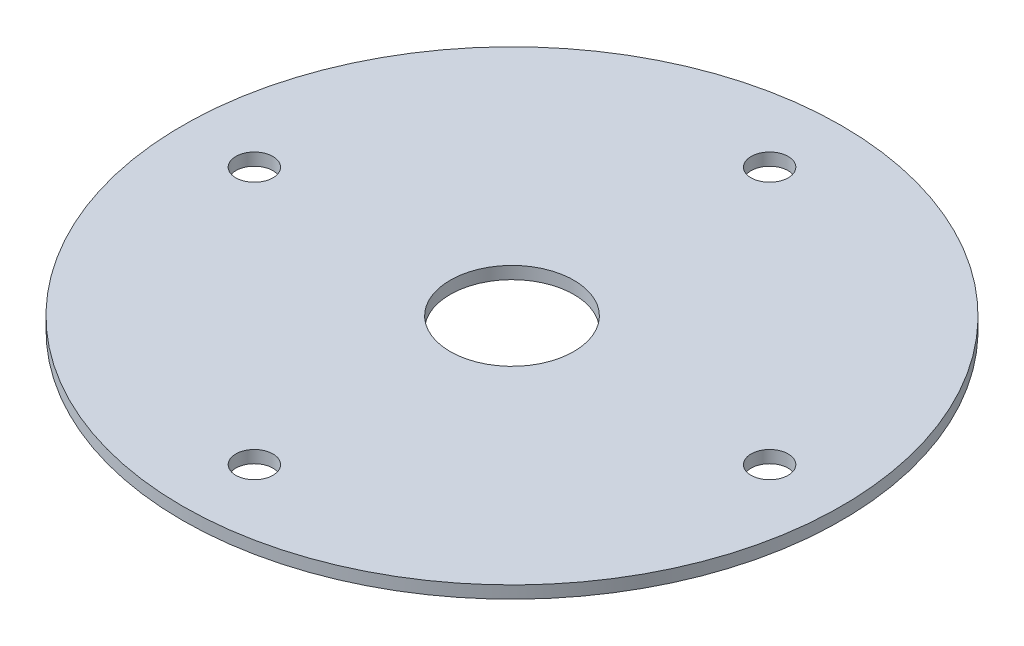
ISO-10303-21;
HEADER;
FILE_DESCRIPTION(('STEP AP214'),'2;1');
FILE_NAME('part.step','',(''),(''),'','','');
FILE_SCHEMA(('AUTOMOTIVE_DESIGN { 1 0 10303 214 1 1 1 1 }'));
ENDSEC;
DATA;
#1=APPLICATION_CONTEXT('core data for automotive mechanical design processes');
#2=APPLICATION_PROTOCOL_DEFINITION('international standard','automotive_design',2000,#1);
#3=PRODUCT_CONTEXT('',#1,'mechanical');
#4=PRODUCT('Part','Part','',(#3));
#5=PRODUCT_RELATED_PRODUCT_CATEGORY('part','',(#4));
#6=PRODUCT_DEFINITION_FORMATION('','',#4);
#7=PRODUCT_DEFINITION_CONTEXT('part definition',#1,'design');
#8=PRODUCT_DEFINITION('design','',#6,#7);
#9=PRODUCT_DEFINITION_SHAPE('','',#8);
#10=(LENGTH_UNIT() NAMED_UNIT(*) SI_UNIT(.MILLI.,.METRE.));
#11=(NAMED_UNIT(*) PLANE_ANGLE_UNIT() SI_UNIT($,.RADIAN.));
#12=(NAMED_UNIT(*) SI_UNIT($,.STERADIAN.) SOLID_ANGLE_UNIT());
#13=UNCERTAINTY_MEASURE_WITH_UNIT(LENGTH_MEASURE(1.E-05),#10,'distance_accuracy_value','');
#14=(GEOMETRIC_REPRESENTATION_CONTEXT(3) GLOBAL_UNCERTAINTY_ASSIGNED_CONTEXT((#13)) GLOBAL_UNIT_ASSIGNED_CONTEXT((#10,
#11,#12)) REPRESENTATION_CONTEXT('',''));
#15=CARTESIAN_POINT('',(0.,0.,0.));
#16=DIRECTION('',(0.,0.,1.));
#17=DIRECTION('',(1.,0.,0.));
#18=AXIS2_PLACEMENT_3D('',#15,#16,#17);
#19=CARTESIAN_POINT('',(0.,3.,0.));
#20=DIRECTION('',(0.,1.,0.));
#21=DIRECTION('',(0.,0.,1.));
#22=AXIS2_PLACEMENT_3D('',#19,#20,#21);
#23=PLANE('',#22);
#24=CARTESIAN_POINT('',(-4.36435167355392E-13,3.,62.5));
#25=DIRECTION('',(0.,1.,0.));
#26=DIRECTION('',(0.,0.,1.));
#27=AXIS2_PLACEMENT_3D('',#24,#25,#26);
#28=CIRCLE('',#27,4.5);
#29=CARTESIAN_POINT('',(-4.36435167355392E-13,3.,67.));
#30=VERTEX_POINT('',#29);
#31=EDGE_CURVE('E63',#30,#30,#28,.T.);
#32=ORIENTED_EDGE('',*,*,#31,.F.);
#33=EDGE_LOOP('',(#32));
#34=FACE_BOUND('',#33,.T.);
#35=CARTESIAN_POINT('',(0.,3.,-62.5));
#36=DIRECTION('',(0.,1.,0.));
#37=DIRECTION('',(0.,0.,1.));
#38=AXIS2_PLACEMENT_3D('',#35,#36,#37);
#39=CIRCLE('',#38,4.5);
#40=CARTESIAN_POINT('',(0.,3.,-58.));
#41=VERTEX_POINT('',#40);
#42=EDGE_CURVE('E51',#41,#41,#39,.T.);
#43=ORIENTED_EDGE('',*,*,#42,.F.);
#44=EDGE_LOOP('',(#43));
#45=FACE_BOUND('',#44,.T.);
#46=CARTESIAN_POINT('',(0.,3.,0.));
#47=DIRECTION('',(0.,1.,0.));
#48=DIRECTION('',(0.,0.,1.));
#49=AXIS2_PLACEMENT_3D('',#46,#47,#48);
#50=CIRCLE('',#49,79.95);
#51=CARTESIAN_POINT('',(0.,3.,79.95));
#52=VERTEX_POINT('',#51);
#53=EDGE_CURVE('E10',#52,#52,#50,.T.);
#54=ORIENTED_EDGE('',*,*,#53,.T.);
#55=EDGE_LOOP('',(#54));
#56=FACE_BOUND('',#55,.T.);
#57=CARTESIAN_POINT('',(0.,3.,0.));
#58=DIRECTION('',(0.,1.,0.));
#59=DIRECTION('',(0.,0.,1.));
#60=AXIS2_PLACEMENT_3D('',#57,#58,#59);
#61=CIRCLE('',#60,15.);
#62=CARTESIAN_POINT('',(0.,3.,15.));
#63=VERTEX_POINT('',#62);
#64=EDGE_CURVE('E46',#63,#63,#61,.T.);
#65=ORIENTED_EDGE('',*,*,#64,.F.);
#66=EDGE_LOOP('',(#65));
#67=FACE_BOUND('',#66,.T.);
#68=CARTESIAN_POINT('',(62.5,3.,2.18217583677696E-13));
#69=DIRECTION('',(0.,1.,0.));
#70=DIRECTION('',(0.,0.,1.));
#71=AXIS2_PLACEMENT_3D('',#68,#69,#70);
#72=CIRCLE('',#71,4.5);
#73=CARTESIAN_POINT('',(62.5,3.,4.50000000000022));
#74=VERTEX_POINT('',#73);
#75=EDGE_CURVE('E57',#74,#74,#72,.T.);
#76=ORIENTED_EDGE('',*,*,#75,.F.);
#77=EDGE_LOOP('',(#76));
#78=FACE_BOUND('',#77,.T.);
#79=CARTESIAN_POINT('',(-62.5,3.,-6.54652751033088E-13));
#80=DIRECTION('',(0.,1.,0.));
#81=DIRECTION('',(0.,0.,1.));
#82=AXIS2_PLACEMENT_3D('',#79,#80,#81);
#83=CIRCLE('',#82,4.5);
#84=CARTESIAN_POINT('',(-62.5,3.,4.49999999999934));
#85=VERTEX_POINT('',#84);
#86=EDGE_CURVE('E69',#85,#85,#83,.T.);
#87=ORIENTED_EDGE('',*,*,#86,.F.);
#88=EDGE_LOOP('',(#87));
#89=FACE_BOUND('',#88,.T.);
#90=ADVANCED_FACE('F35',(#34,#45,#56,#67,#78,#89),#23,.T.);
#91=CARTESIAN_POINT('',(0.,0.,0.));
#92=DIRECTION('',(0.,1.,0.));
#93=DIRECTION('',(0.,0.,1.));
#94=AXIS2_PLACEMENT_3D('',#91,#92,#93);
#95=PLANE('',#94);
#96=CARTESIAN_POINT('',(0.,0.,0.));
#97=DIRECTION('',(0.,1.,0.));
#98=DIRECTION('',(0.,0.,1.));
#99=AXIS2_PLACEMENT_3D('',#96,#97,#98);
#100=CIRCLE('',#99,79.95);
#101=CARTESIAN_POINT('',(0.,0.,79.95));
#102=VERTEX_POINT('',#101);
#103=EDGE_CURVE('E39',#102,#102,#100,.T.);
#104=ORIENTED_EDGE('',*,*,#103,.F.);
#105=EDGE_LOOP('',(#104));
#106=FACE_BOUND('',#105,.T.);
#107=CARTESIAN_POINT('',(0.,0.,0.));
#108=DIRECTION('',(0.,1.,0.));
#109=DIRECTION('',(0.,0.,1.));
#110=AXIS2_PLACEMENT_3D('',#107,#108,#109);
#111=CIRCLE('',#110,15.);
#112=CARTESIAN_POINT('',(0.,0.,15.));
#113=VERTEX_POINT('',#112);
#114=EDGE_CURVE('E48',#113,#113,#111,.T.);
#115=ORIENTED_EDGE('',*,*,#114,.T.);
#116=EDGE_LOOP('',(#115));
#117=FACE_BOUND('',#116,.T.);
#118=CARTESIAN_POINT('',(0.,0.,-62.5));
#119=DIRECTION('',(0.,1.,0.));
#120=DIRECTION('',(0.,0.,1.));
#121=AXIS2_PLACEMENT_3D('',#118,#119,#120);
#122=CIRCLE('',#121,4.5);
#123=CARTESIAN_POINT('',(0.,0.,-58.));
#124=VERTEX_POINT('',#123);
#125=EDGE_CURVE('E54',#124,#124,#122,.T.);
#126=ORIENTED_EDGE('',*,*,#125,.T.);
#127=EDGE_LOOP('',(#126));
#128=FACE_BOUND('',#127,.T.);
#129=CARTESIAN_POINT('',(62.5,0.,2.18217583677696E-13));
#130=DIRECTION('',(0.,1.,0.));
#131=DIRECTION('',(0.,0.,1.));
#132=AXIS2_PLACEMENT_3D('',#129,#130,#131);
#133=CIRCLE('',#132,4.5);
#134=CARTESIAN_POINT('',(62.5,0.,4.50000000000022));
#135=VERTEX_POINT('',#134);
#136=EDGE_CURVE('E60',#135,#135,#133,.T.);
#137=ORIENTED_EDGE('',*,*,#136,.T.);
#138=EDGE_LOOP('',(#137));
#139=FACE_BOUND('',#138,.T.);
#140=CARTESIAN_POINT('',(-4.36435167355392E-13,0.,62.5));
#141=DIRECTION('',(0.,1.,0.));
#142=DIRECTION('',(0.,0.,1.));
#143=AXIS2_PLACEMENT_3D('',#140,#141,#142);
#144=CIRCLE('',#143,4.5);
#145=CARTESIAN_POINT('',(-4.36435167355392E-13,0.,67.));
#146=VERTEX_POINT('',#145);
#147=EDGE_CURVE('E66',#146,#146,#144,.T.);
#148=ORIENTED_EDGE('',*,*,#147,.T.);
#149=EDGE_LOOP('',(#148));
#150=FACE_BOUND('',#149,.T.);
#151=CARTESIAN_POINT('',(-62.5,0.,-6.54652751033088E-13));
#152=DIRECTION('',(0.,1.,0.));
#153=DIRECTION('',(0.,0.,1.));
#154=AXIS2_PLACEMENT_3D('',#151,#152,#153);
#155=CIRCLE('',#154,4.5);
#156=CARTESIAN_POINT('',(-62.5,0.,4.49999999999934));
#157=VERTEX_POINT('',#156);
#158=EDGE_CURVE('E72',#157,#157,#155,.T.);
#159=ORIENTED_EDGE('',*,*,#158,.T.);
#160=EDGE_LOOP('',(#159));
#161=FACE_BOUND('',#160,.T.);
#162=ADVANCED_FACE('F82',(#106,#117,#128,#139,#150,#161),#95,.F.);
#163=CARTESIAN_POINT('',(0.,3.,0.));
#164=DIRECTION('',(0.,-1.,0.));
#165=DIRECTION('',(0.,0.,-1.));
#166=AXIS2_PLACEMENT_3D('',#163,#164,#165);
#167=CYLINDRICAL_SURFACE('',#166,79.95);
#168=ORIENTED_EDGE('',*,*,#53,.F.);
#169=EDGE_LOOP('',(#168));
#170=FACE_BOUND('',#169,.T.);
#171=ORIENTED_EDGE('',*,*,#103,.T.);
#172=EDGE_LOOP('',(#171));
#173=FACE_BOUND('',#172,.T.);
#174=ADVANCED_FACE('F37',(#170,#173),#167,.T.);
#175=CARTESIAN_POINT('',(0.,3.,0.));
#176=DIRECTION('',(0.,-1.,0.));
#177=DIRECTION('',(0.,0.,-1.));
#178=AXIS2_PLACEMENT_3D('',#175,#176,#177);
#179=CYLINDRICAL_SURFACE('',#178,15.);
#180=ORIENTED_EDGE('',*,*,#64,.T.);
#181=EDGE_LOOP('',(#180));
#182=FACE_BOUND('',#181,.T.);
#183=ORIENTED_EDGE('',*,*,#114,.F.);
#184=EDGE_LOOP('',(#183));
#185=FACE_BOUND('',#184,.T.);
#186=ADVANCED_FACE('F92',(#182,#185),#179,.F.);
#187=CARTESIAN_POINT('',(0.,3.,-62.5));
#188=DIRECTION('',(0.,-1.,0.));
#189=DIRECTION('',(0.,0.,-1.));
#190=AXIS2_PLACEMENT_3D('',#187,#188,#189);
#191=CYLINDRICAL_SURFACE('',#190,4.5);
#192=ORIENTED_EDGE('',*,*,#42,.T.);
#193=EDGE_LOOP('',(#192));
#194=FACE_BOUND('',#193,.T.);
#195=ORIENTED_EDGE('',*,*,#125,.F.);
#196=EDGE_LOOP('',(#195));
#197=FACE_BOUND('',#196,.T.);
#198=ADVANCED_FACE('F95',(#194,#197),#191,.F.);
#199=CARTESIAN_POINT('',(62.5,3.,2.18217583677696E-13));
#200=DIRECTION('',(0.,-1.,0.));
#201=DIRECTION('',(0.,0.,-1.));
#202=AXIS2_PLACEMENT_3D('',#199,#200,#201);
#203=CYLINDRICAL_SURFACE('',#202,4.5);
#204=ORIENTED_EDGE('',*,*,#75,.T.);
#205=EDGE_LOOP('',(#204));
#206=FACE_BOUND('',#205,.T.);
#207=ORIENTED_EDGE('',*,*,#136,.F.);
#208=EDGE_LOOP('',(#207));
#209=FACE_BOUND('',#208,.T.);
#210=ADVANCED_FACE('F99',(#206,#209),#203,.F.);
#211=CARTESIAN_POINT('',(-4.36435167355392E-13,3.,62.5));
#212=DIRECTION('',(0.,-1.,0.));
#213=DIRECTION('',(0.,0.,-1.));
#214=AXIS2_PLACEMENT_3D('',#211,#212,#213);
#215=CYLINDRICAL_SURFACE('',#214,4.5);
#216=ORIENTED_EDGE('',*,*,#31,.T.);
#217=EDGE_LOOP('',(#216));
#218=FACE_BOUND('',#217,.T.);
#219=ORIENTED_EDGE('',*,*,#147,.F.);
#220=EDGE_LOOP('',(#219));
#221=FACE_BOUND('',#220,.T.);
#222=ADVANCED_FACE('F103',(#218,#221),#215,.F.);
#223=CARTESIAN_POINT('',(-62.5,3.,-6.54652751033088E-13));
#224=DIRECTION('',(0.,-1.,0.));
#225=DIRECTION('',(0.,0.,-1.));
#226=AXIS2_PLACEMENT_3D('',#223,#224,#225);
#227=CYLINDRICAL_SURFACE('',#226,4.5);
#228=ORIENTED_EDGE('',*,*,#86,.T.);
#229=EDGE_LOOP('',(#228));
#230=FACE_BOUND('',#229,.T.);
#231=ORIENTED_EDGE('',*,*,#158,.F.);
#232=EDGE_LOOP('',(#231));
#233=FACE_BOUND('',#232,.T.);
#234=ADVANCED_FACE('F78',(#230,#233),#227,.F.);
#235=CLOSED_SHELL('',(#90,#162,#174,#186,#198,#210,#222,#234));
#236=MANIFOLD_SOLID_BREP('B2',#235);
#237=ADVANCED_BREP_SHAPE_REPRESENTATION('',(#18,#236),#14);
#238=SHAPE_DEFINITION_REPRESENTATION(#9,#237);
ENDSEC;
END-ISO-10303-21;
